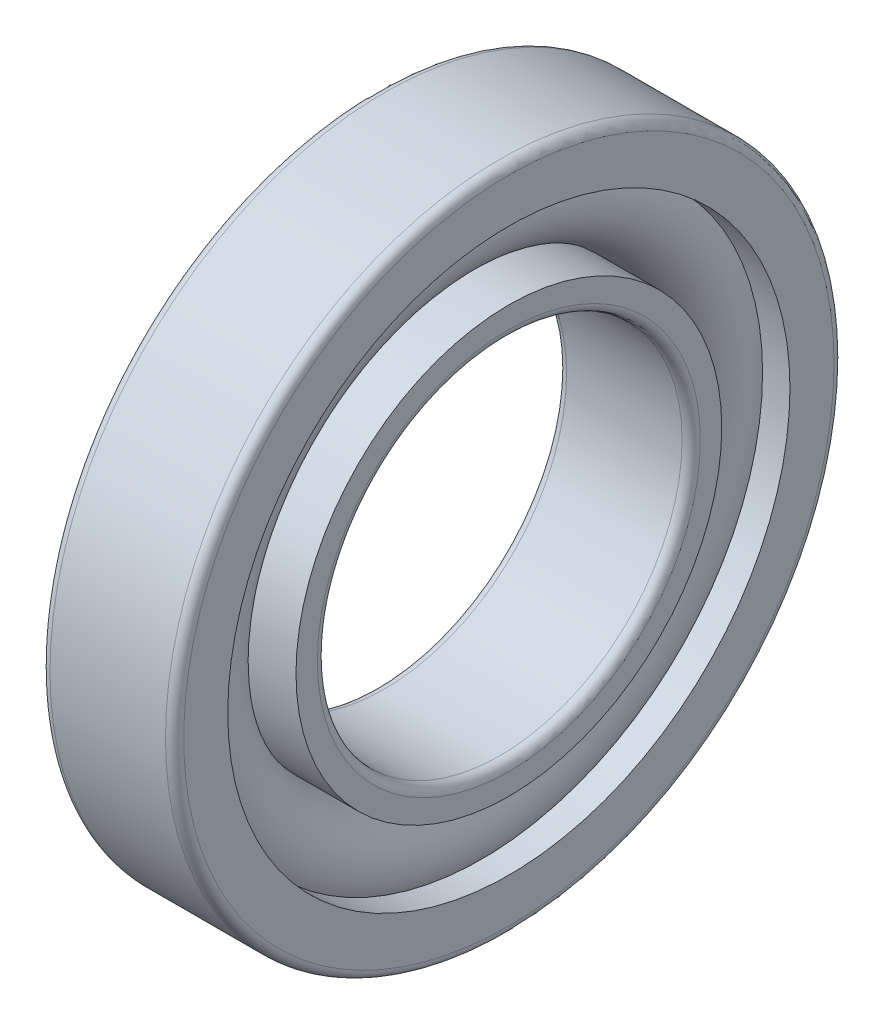
ISO-10303-21;
HEADER;
FILE_DESCRIPTION(('STEP AP214'),'2;1');
FILE_NAME('part.step','',(''),(''),'','','');
FILE_SCHEMA(('AUTOMOTIVE_DESIGN { 1 0 10303 214 1 1 1 1 }'));
ENDSEC;
DATA;
#1=APPLICATION_CONTEXT('core data for automotive mechanical design processes');
#2=APPLICATION_PROTOCOL_DEFINITION('international standard','automotive_design',2000,#1);
#3=PRODUCT_CONTEXT('',#1,'mechanical');
#4=PRODUCT('Part','Part','',(#3));
#5=PRODUCT_RELATED_PRODUCT_CATEGORY('part','',(#4));
#6=PRODUCT_DEFINITION_FORMATION('','',#4);
#7=PRODUCT_DEFINITION_CONTEXT('part definition',#1,'design');
#8=PRODUCT_DEFINITION('design','',#6,#7);
#9=PRODUCT_DEFINITION_SHAPE('','',#8);
#10=(LENGTH_UNIT() NAMED_UNIT(*) SI_UNIT(.MILLI.,.METRE.));
#11=(NAMED_UNIT(*) PLANE_ANGLE_UNIT() SI_UNIT($,.RADIAN.));
#12=(NAMED_UNIT(*) SI_UNIT($,.STERADIAN.) SOLID_ANGLE_UNIT());
#13=UNCERTAINTY_MEASURE_WITH_UNIT(LENGTH_MEASURE(1.E-05),#10,'distance_accuracy_value','');
#14=(GEOMETRIC_REPRESENTATION_CONTEXT(3) GLOBAL_UNCERTAINTY_ASSIGNED_CONTEXT((#13)) GLOBAL_UNIT_ASSIGNED_CONTEXT((#10,
#11,#12)) REPRESENTATION_CONTEXT('',''));
#15=CARTESIAN_POINT('',(0.,0.,0.));
#16=DIRECTION('',(0.,0.,1.));
#17=DIRECTION('',(1.,0.,0.));
#18=AXIS2_PLACEMENT_3D('',#15,#16,#17);
#19=CARTESIAN_POINT('',(0.,0.,0.));
#20=DIRECTION('',(-1.,0.,0.));
#21=DIRECTION('',(0.,0.,1.));
#22=AXIS2_PLACEMENT_3D('',#19,#20,#21);
#23=TOROIDAL_SURFACE('',#22,42.5,7.5);
#24=CARTESIAN_POINT('',(6.49519052838329,0.,0.));
#25=DIRECTION('',(-1.,0.,0.));
#26=DIRECTION('',(0.,0.,1.));
#27=AXIS2_PLACEMENT_3D('',#24,#25,#26);
#28=CIRCLE('',#27,46.25);
#29=CARTESIAN_POINT('',(6.49519052838329,0.,46.25));
#30=VERTEX_POINT('',#29);
#31=EDGE_CURVE('E36',#30,#30,#28,.F.);
#32=ORIENTED_EDGE('',*,*,#31,.T.);
#33=EDGE_LOOP('',(#32));
#34=FACE_BOUND('',#33,.T.);
#35=CARTESIAN_POINT('',(0.611861912525987,0.,0.));
#36=DIRECTION('',(-1.,0.,0.));
#37=DIRECTION('',(0.,0.,1.));
#38=AXIS2_PLACEMENT_3D('',#35,#36,#37);
#39=CIRCLE('',#38,35.025);
#40=CARTESIAN_POINT('',(0.611861912525987,0.,35.025));
#41=VERTEX_POINT('',#40);
#42=EDGE_CURVE('E10',#41,#41,#39,.T.);
#43=ORIENTED_EDGE('',*,*,#42,.T.);
#44=EDGE_LOOP('',(#43));
#45=FACE_BOUND('',#44,.T.);
#46=ADVANCED_FACE('F32',(#34,#45),#23,.T.);
#47=CARTESIAN_POINT('',(-20.6375,0.,0.));
#48=DIRECTION('',(1.,0.,0.));
#49=DIRECTION('',(0.,0.,-1.));
#50=AXIS2_PLACEMENT_3D('',#47,#48,#49);
#51=CYLINDRICAL_SURFACE('',#50,35.025);
#52=CARTESIAN_POINT('',(11.,0.,0.));
#53=DIRECTION('',(1.,0.,0.));
#54=DIRECTION('',(0.,0.,-1.));
#55=AXIS2_PLACEMENT_3D('',#52,#53,#54);
#56=CIRCLE('',#55,35.025);
#57=CARTESIAN_POINT('',(11.,0.,-35.025));
#58=VERTEX_POINT('',#57);
#59=EDGE_CURVE('E45',#58,#58,#56,.T.);
#60=ORIENTED_EDGE('',*,*,#59,.F.);
#61=EDGE_LOOP('',(#60));
#62=FACE_BOUND('',#61,.T.);
#63=ORIENTED_EDGE('',*,*,#42,.F.);
#64=EDGE_LOOP('',(#63));
#65=FACE_BOUND('',#64,.T.);
#66=ADVANCED_FACE('F84',(#62,#65),#51,.T.);
#67=CARTESIAN_POINT('',(-20.6375,0.,0.));
#68=DIRECTION('',(1.,0.,0.));
#69=DIRECTION('',(0.,0.,-1.));
#70=AXIS2_PLACEMENT_3D('',#67,#68,#69);
#71=CYLINDRICAL_SURFACE('',#70,38.75);
#72=CARTESIAN_POINT('',(-11.,0.,0.));
#73=DIRECTION('',(1.,0.,0.));
#74=DIRECTION('',(0.,0.,-1.));
#75=AXIS2_PLACEMENT_3D('',#72,#73,#74);
#76=CIRCLE('',#75,38.75);
#77=CARTESIAN_POINT('',(-11.,0.,-38.75));
#78=VERTEX_POINT('',#77);
#79=EDGE_CURVE('E54',#78,#78,#76,.T.);
#80=ORIENTED_EDGE('',*,*,#79,.T.);
#81=EDGE_LOOP('',(#80));
#82=FACE_BOUND('',#81,.T.);
#83=CARTESIAN_POINT('',(-6.49519052838328,0.,0.));
#84=DIRECTION('',(1.,0.,0.));
#85=DIRECTION('',(0.,0.,-1.));
#86=AXIS2_PLACEMENT_3D('',#83,#84,#85);
#87=CIRCLE('',#86,38.75);
#88=CARTESIAN_POINT('',(-6.49519052838328,0.,-38.75));
#89=VERTEX_POINT('',#88);
#90=EDGE_CURVE('E40',#89,#89,#87,.T.);
#91=ORIENTED_EDGE('',*,*,#90,.F.);
#92=EDGE_LOOP('',(#91));
#93=FACE_BOUND('',#92,.T.);
#94=ADVANCED_FACE('F87',(#82,#93),#71,.T.);
#95=CARTESIAN_POINT('',(11.,31.5,0.));
#96=DIRECTION('',(1.,0.,0.));
#97=DIRECTION('',(0.,0.,-1.));
#98=AXIS2_PLACEMENT_3D('',#95,#96,#97);
#99=PLANE('',#98);
#100=ORIENTED_EDGE('',*,*,#59,.T.);
#101=EDGE_LOOP('',(#100));
#102=FACE_BOUND('',#101,.T.);
#103=CARTESIAN_POINT('',(11.,0.,0.));
#104=DIRECTION('',(1.,0.,0.));
#105=DIRECTION('',(0.,0.,-1.));
#106=AXIS2_PLACEMENT_3D('',#103,#104,#105);
#107=CIRCLE('',#106,31.5);
#108=CARTESIAN_POINT('',(11.,0.,-31.5));
#109=VERTEX_POINT('',#108);
#110=EDGE_CURVE('E76',#109,#109,#107,.T.);
#111=ORIENTED_EDGE('',*,*,#110,.F.);
#112=EDGE_LOOP('',(#111));
#113=FACE_BOUND('',#112,.T.);
#114=ADVANCED_FACE('F81',(#102,#113),#99,.T.);
#115=CARTESIAN_POINT('',(9.5,0.,0.));
#116=DIRECTION('',(1.,0.,0.));
#117=DIRECTION('',(0.,0.,-1.));
#118=AXIS2_PLACEMENT_3D('',#115,#116,#117);
#119=TOROIDAL_SURFACE('',#118,31.5,1.5);
#120=ORIENTED_EDGE('',*,*,#110,.T.);
#121=EDGE_LOOP('',(#120));
#122=FACE_BOUND('',#121,.T.);
#123=CARTESIAN_POINT('',(9.5,0.,0.));
#124=DIRECTION('',(1.,0.,0.));
#125=DIRECTION('',(0.,0.,-1.));
#126=AXIS2_PLACEMENT_3D('',#123,#124,#125);
#127=CIRCLE('',#126,30.);
#128=CARTESIAN_POINT('',(9.5,0.,-30.));
#129=VERTEX_POINT('',#128);
#130=EDGE_CURVE('E73',#129,#129,#127,.T.);
#131=ORIENTED_EDGE('',*,*,#130,.F.);
#132=EDGE_LOOP('',(#131));
#133=FACE_BOUND('',#132,.T.);
#134=ADVANCED_FACE('F98',(#122,#133),#119,.T.);
#135=CARTESIAN_POINT('',(-20.6375,0.,0.));
#136=DIRECTION('',(1.,0.,0.));
#137=DIRECTION('',(0.,0.,-1.));
#138=AXIS2_PLACEMENT_3D('',#135,#136,#137);
#139=CYLINDRICAL_SURFACE('',#138,30.);
#140=ORIENTED_EDGE('',*,*,#130,.T.);
#141=EDGE_LOOP('',(#140));
#142=FACE_BOUND('',#141,.T.);
#143=CARTESIAN_POINT('',(-9.5,0.,0.));
#144=DIRECTION('',(1.,0.,0.));
#145=DIRECTION('',(0.,0.,-1.));
#146=AXIS2_PLACEMENT_3D('',#143,#144,#145);
#147=CIRCLE('',#146,30.);
#148=CARTESIAN_POINT('',(-9.5,0.,-30.));
#149=VERTEX_POINT('',#148);
#150=EDGE_CURVE('E70',#149,#149,#147,.T.);
#151=ORIENTED_EDGE('',*,*,#150,.F.);
#152=EDGE_LOOP('',(#151));
#153=FACE_BOUND('',#152,.T.);
#154=ADVANCED_FACE('F101',(#142,#153),#139,.F.);
#155=CARTESIAN_POINT('',(-9.5,0.,0.));
#156=DIRECTION('',(1.,0.,0.));
#157=DIRECTION('',(0.,0.,-1.));
#158=AXIS2_PLACEMENT_3D('',#155,#156,#157);
#159=TOROIDAL_SURFACE('',#158,31.5,1.5);
#160=ORIENTED_EDGE('',*,*,#150,.T.);
#161=EDGE_LOOP('',(#160));
#162=FACE_BOUND('',#161,.T.);
#163=CARTESIAN_POINT('',(-11.,0.,0.));
#164=DIRECTION('',(1.,0.,0.));
#165=DIRECTION('',(0.,0.,-1.));
#166=AXIS2_PLACEMENT_3D('',#163,#164,#165);
#167=CIRCLE('',#166,31.5);
#168=CARTESIAN_POINT('',(-11.,0.,-31.5));
#169=VERTEX_POINT('',#168);
#170=EDGE_CURVE('E67',#169,#169,#167,.T.);
#171=ORIENTED_EDGE('',*,*,#170,.F.);
#172=EDGE_LOOP('',(#171));
#173=FACE_BOUND('',#172,.T.);
#174=ADVANCED_FACE('F105',(#162,#173),#159,.T.);
#175=CARTESIAN_POINT('',(-11.,38.75,0.));
#176=DIRECTION('',(-1.,0.,0.));
#177=DIRECTION('',(0.,0.,1.));
#178=AXIS2_PLACEMENT_3D('',#175,#176,#177);
#179=PLANE('',#178);
#180=ORIENTED_EDGE('',*,*,#170,.T.);
#181=EDGE_LOOP('',(#180));
#182=FACE_BOUND('',#181,.T.);
#183=ORIENTED_EDGE('',*,*,#79,.F.);
#184=EDGE_LOOP('',(#183));
#185=FACE_BOUND('',#184,.T.);
#186=ADVANCED_FACE('F109',(#182,#185),#179,.T.);
#187=CARTESIAN_POINT('',(-0.611861912525987,0.,0.));
#188=DIRECTION('',(1.,0.,0.));
#189=DIRECTION('',(0.,0.,-1.));
#190=AXIS2_PLACEMENT_3D('',#187,#188,#189);
#191=CIRCLE('',#190,49.975);
#192=CARTESIAN_POINT('',(-0.611861912525987,0.,-49.975));
#193=VERTEX_POINT('',#192);
#194=EDGE_CURVE('E48',#193,#193,#191,.F.);
#195=ORIENTED_EDGE('',*,*,#194,.T.);
#196=EDGE_LOOP('',(#195));
#197=FACE_BOUND('',#196,.T.);
#198=ORIENTED_EDGE('',*,*,#90,.T.);
#199=EDGE_LOOP('',(#198));
#200=FACE_BOUND('',#199,.T.);
#201=ADVANCED_FACE('F34',(#197,#200),#23,.T.);
#202=CARTESIAN_POINT('',(-20.6375,0.,0.));
#203=DIRECTION('',(1.,0.,0.));
#204=DIRECTION('',(0.,0.,-1.));
#205=AXIS2_PLACEMENT_3D('',#202,#203,#204);
#206=CYLINDRICAL_SURFACE('',#205,46.25);
#207=CARTESIAN_POINT('',(11.,0.,0.));
#208=DIRECTION('',(1.,0.,0.));
#209=DIRECTION('',(0.,0.,-1.));
#210=AXIS2_PLACEMENT_3D('',#207,#208,#209);
#211=CIRCLE('',#210,46.25);
#212=CARTESIAN_POINT('',(11.,0.,-46.25));
#213=VERTEX_POINT('',#212);
#214=EDGE_CURVE('E150',#213,#213,#211,.T.);
#215=ORIENTED_EDGE('',*,*,#214,.T.);
#216=EDGE_LOOP('',(#215));
#217=FACE_BOUND('',#216,.T.);
#218=ORIENTED_EDGE('',*,*,#31,.F.);
#219=EDGE_LOOP('',(#218));
#220=FACE_BOUND('',#219,.T.);
#221=ADVANCED_FACE('F131',(#217,#220),#206,.F.);
#222=CARTESIAN_POINT('',(-20.6375,0.,0.));
#223=DIRECTION('',(1.,0.,0.));
#224=DIRECTION('',(0.,0.,-1.));
#225=AXIS2_PLACEMENT_3D('',#222,#223,#224);
#226=CYLINDRICAL_SURFACE('',#225,49.975);
#227=CARTESIAN_POINT('',(-11.,0.,0.));
#228=DIRECTION('',(1.,0.,0.));
#229=DIRECTION('',(0.,0.,-1.));
#230=AXIS2_PLACEMENT_3D('',#227,#228,#229);
#231=CIRCLE('',#230,49.975);
#232=CARTESIAN_POINT('',(-11.,0.,-49.975));
#233=VERTEX_POINT('',#232);
#234=EDGE_CURVE('E145',#233,#233,#231,.T.);
#235=ORIENTED_EDGE('',*,*,#234,.F.);
#236=EDGE_LOOP('',(#235));
#237=FACE_BOUND('',#236,.T.);
#238=ORIENTED_EDGE('',*,*,#194,.F.);
#239=EDGE_LOOP('',(#238));
#240=FACE_BOUND('',#239,.T.);
#241=ADVANCED_FACE('F118',(#237,#240),#226,.F.);
#242=CARTESIAN_POINT('',(-9.5,0.,0.));
#243=DIRECTION('',(1.,0.,0.));
#244=DIRECTION('',(0.,0.,-1.));
#245=AXIS2_PLACEMENT_3D('',#242,#243,#244);
#246=TOROIDAL_SURFACE('',#245,53.5,1.49999999999999);
#247=CARTESIAN_POINT('',(-11.,0.,0.));
#248=DIRECTION('',(1.,0.,0.));
#249=DIRECTION('',(0.,0.,-1.));
#250=AXIS2_PLACEMENT_3D('',#247,#248,#249);
#251=CIRCLE('',#250,53.5);
#252=CARTESIAN_POINT('',(-11.,0.,-53.5));
#253=VERTEX_POINT('',#252);
#254=EDGE_CURVE('E148',#253,#253,#251,.T.);
#255=ORIENTED_EDGE('',*,*,#254,.T.);
#256=EDGE_LOOP('',(#255));
#257=FACE_BOUND('',#256,.T.);
#258=CARTESIAN_POINT('',(-9.5,0.,0.));
#259=DIRECTION('',(1.,0.,0.));
#260=DIRECTION('',(0.,0.,-1.));
#261=AXIS2_PLACEMENT_3D('',#258,#259,#260);
#262=CIRCLE('',#261,55.);
#263=CARTESIAN_POINT('',(-9.5,0.,-55.));
#264=VERTEX_POINT('',#263);
#265=EDGE_CURVE('E50',#264,#264,#262,.T.);
#266=ORIENTED_EDGE('',*,*,#265,.F.);
#267=EDGE_LOOP('',(#266));
#268=FACE_BOUND('',#267,.T.);
#269=ADVANCED_FACE('F114',(#257,#268),#246,.T.);
#270=CARTESIAN_POINT('',(-20.6375,0.,0.));
#271=DIRECTION('',(1.,0.,0.));
#272=DIRECTION('',(0.,0.,-1.));
#273=AXIS2_PLACEMENT_3D('',#270,#271,#272);
#274=CYLINDRICAL_SURFACE('',#273,55.);
#275=ORIENTED_EDGE('',*,*,#265,.T.);
#276=EDGE_LOOP('',(#275));
#277=FACE_BOUND('',#276,.T.);
#278=CARTESIAN_POINT('',(9.5,0.,0.));
#279=DIRECTION('',(1.,0.,0.));
#280=DIRECTION('',(0.,0.,-1.));
#281=AXIS2_PLACEMENT_3D('',#278,#279,#280);
#282=CIRCLE('',#281,55.);
#283=CARTESIAN_POINT('',(9.5,0.,-55.));
#284=VERTEX_POINT('',#283);
#285=EDGE_CURVE('E56',#284,#284,#282,.T.);
#286=ORIENTED_EDGE('',*,*,#285,.F.);
#287=EDGE_LOOP('',(#286));
#288=FACE_BOUND('',#287,.T.);
#289=ADVANCED_FACE('F117',(#277,#288),#274,.T.);
#290=CARTESIAN_POINT('',(9.5,0.,0.));
#291=DIRECTION('',(1.,0.,0.));
#292=DIRECTION('',(0.,0.,-1.));
#293=AXIS2_PLACEMENT_3D('',#290,#291,#292);
#294=TOROIDAL_SURFACE('',#293,53.5,1.49999999999999);
#295=ORIENTED_EDGE('',*,*,#285,.T.);
#296=EDGE_LOOP('',(#295));
#297=FACE_BOUND('',#296,.T.);
#298=CARTESIAN_POINT('',(11.,0.,0.));
#299=DIRECTION('',(1.,0.,0.));
#300=DIRECTION('',(0.,0.,-1.));
#301=AXIS2_PLACEMENT_3D('',#298,#299,#300);
#302=CIRCLE('',#301,53.5);
#303=CARTESIAN_POINT('',(11.,0.,-53.5));
#304=VERTEX_POINT('',#303);
#305=EDGE_CURVE('E61',#304,#304,#302,.T.);
#306=ORIENTED_EDGE('',*,*,#305,.F.);
#307=EDGE_LOOP('',(#306));
#308=FACE_BOUND('',#307,.T.);
#309=ADVANCED_FACE('F122',(#297,#308),#294,.T.);
#310=CARTESIAN_POINT('',(11.,53.5,0.));
#311=DIRECTION('',(1.,0.,0.));
#312=DIRECTION('',(0.,0.,-1.));
#313=AXIS2_PLACEMENT_3D('',#310,#311,#312);
#314=PLANE('',#313);
#315=ORIENTED_EDGE('',*,*,#305,.T.);
#316=EDGE_LOOP('',(#315));
#317=FACE_BOUND('',#316,.T.);
#318=ORIENTED_EDGE('',*,*,#214,.F.);
#319=EDGE_LOOP('',(#318));
#320=FACE_BOUND('',#319,.T.);
#321=ADVANCED_FACE('F125',(#317,#320),#314,.T.);
#322=CARTESIAN_POINT('',(-11.,49.975,0.));
#323=DIRECTION('',(-1.,0.,0.));
#324=DIRECTION('',(0.,0.,1.));
#325=AXIS2_PLACEMENT_3D('',#322,#323,#324);
#326=PLANE('',#325);
#327=ORIENTED_EDGE('',*,*,#234,.T.);
#328=EDGE_LOOP('',(#327));
#329=FACE_BOUND('',#328,.T.);
#330=ORIENTED_EDGE('',*,*,#254,.F.);
#331=EDGE_LOOP('',(#330));
#332=FACE_BOUND('',#331,.T.);
#333=ADVANCED_FACE('F129',(#329,#332),#326,.T.);
#334=CLOSED_SHELL('',(#46,#66,#94,#114,#134,#154,#174,#186,#201,#221,#241,#269,#289,#309,#321,#333));
#335=MANIFOLD_SOLID_BREP('B2',#334);
#336=ADVANCED_BREP_SHAPE_REPRESENTATION('',(#18,#335),#14);
#337=SHAPE_DEFINITION_REPRESENTATION(#9,#336);
ENDSEC;
END-ISO-10303-21;
